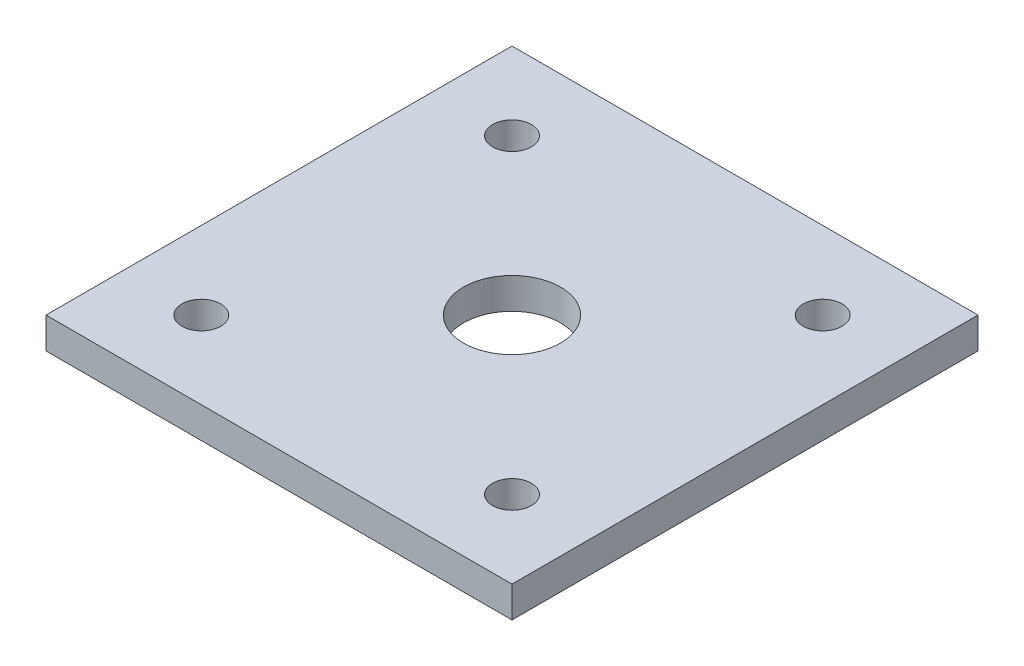
ISO-10303-21;
HEADER;
FILE_DESCRIPTION(('STEP AP214'),'2;1');
FILE_NAME('part.step','',(''),(''),'','','');
FILE_SCHEMA(('AUTOMOTIVE_DESIGN { 1 0 10303 214 1 1 1 1 }'));
ENDSEC;
DATA;
#1=APPLICATION_CONTEXT('core data for automotive mechanical design processes');
#2=APPLICATION_PROTOCOL_DEFINITION('international standard','automotive_design',2000,#1);
#3=PRODUCT_CONTEXT('',#1,'mechanical');
#4=PRODUCT('Part','Part','',(#3));
#5=PRODUCT_RELATED_PRODUCT_CATEGORY('part','',(#4));
#6=PRODUCT_DEFINITION_FORMATION('','',#4);
#7=PRODUCT_DEFINITION_CONTEXT('part definition',#1,'design');
#8=PRODUCT_DEFINITION('design','',#6,#7);
#9=PRODUCT_DEFINITION_SHAPE('','',#8);
#10=(LENGTH_UNIT() NAMED_UNIT(*) SI_UNIT(.MILLI.,.METRE.));
#11=(NAMED_UNIT(*) PLANE_ANGLE_UNIT() SI_UNIT($,.RADIAN.));
#12=(NAMED_UNIT(*) SI_UNIT($,.STERADIAN.) SOLID_ANGLE_UNIT());
#13=UNCERTAINTY_MEASURE_WITH_UNIT(LENGTH_MEASURE(1.E-05),#10,'distance_accuracy_value','');
#14=(GEOMETRIC_REPRESENTATION_CONTEXT(3) GLOBAL_UNCERTAINTY_ASSIGNED_CONTEXT((#13)) GLOBAL_UNIT_ASSIGNED_CONTEXT((#10,
#11,#12)) REPRESENTATION_CONTEXT('',''));
#15=CARTESIAN_POINT('',(0.,0.,0.));
#16=DIRECTION('',(0.,0.,1.));
#17=DIRECTION('',(1.,0.,0.));
#18=AXIS2_PLACEMENT_3D('',#15,#16,#17);
#19=CARTESIAN_POINT('',(-60.,8.,60.));
#20=DIRECTION('',(1.,0.,0.));
#21=DIRECTION('',(0.,0.,-1.));
#22=AXIS2_PLACEMENT_3D('',#19,#20,#21);
#23=PLANE('',#22);
#24=DIRECTION('',(0.,0.,1.));
#25=VECTOR('',#24,1.);
#26=CARTESIAN_POINT('',(-60.,0.,60.));
#27=LINE('',#26,#25);
#28=CARTESIAN_POINT('',(-60.,0.,-60.));
#29=VERTEX_POINT('',#28);
#30=CARTESIAN_POINT('',(-60.,0.,60.));
#31=VERTEX_POINT('',#30);
#32=EDGE_CURVE('E107',#29,#31,#27,.T.);
#33=ORIENTED_EDGE('',*,*,#32,.T.);
#34=DIRECTION('',(0.,-1.,0.));
#35=VECTOR('',#34,1.);
#36=CARTESIAN_POINT('',(-60.,8.,60.));
#37=LINE('',#36,#35);
#38=CARTESIAN_POINT('',(-60.,8.,60.));
#39=VERTEX_POINT('',#38);
#40=EDGE_CURVE('E11',#39,#31,#37,.T.);
#41=ORIENTED_EDGE('',*,*,#40,.F.);
#42=DIRECTION('',(0.,0.,1.));
#43=VECTOR('',#42,1.);
#44=CARTESIAN_POINT('',(-60.,8.,60.));
#45=LINE('',#44,#43);
#46=CARTESIAN_POINT('',(-60.,8.,-60.));
#47=VERTEX_POINT('',#46);
#48=EDGE_CURVE('E91',#47,#39,#45,.T.);
#49=ORIENTED_EDGE('',*,*,#48,.F.);
#50=DIRECTION('',(0.,-1.,0.));
#51=VECTOR('',#50,1.);
#52=CARTESIAN_POINT('',(-60.,8.,-60.));
#53=LINE('',#52,#51);
#54=EDGE_CURVE('E103',#47,#29,#53,.T.);
#55=ORIENTED_EDGE('',*,*,#54,.T.);
#56=EDGE_LOOP('',(#33,#41,#49,#55));
#57=FACE_BOUND('',#56,.T.);
#58=ADVANCED_FACE('F39',(#57),#23,.F.);
#59=CARTESIAN_POINT('',(60.,8.,60.));
#60=DIRECTION('',(0.,0.,-1.));
#61=DIRECTION('',(-1.,0.,0.));
#62=AXIS2_PLACEMENT_3D('',#59,#60,#61);
#63=PLANE('',#62);
#64=DIRECTION('',(1.,0.,0.));
#65=VECTOR('',#64,1.);
#66=CARTESIAN_POINT('',(60.,0.,60.));
#67=LINE('',#66,#65);
#68=CARTESIAN_POINT('',(60.,0.,60.));
#69=VERTEX_POINT('',#68);
#70=EDGE_CURVE('E96',#31,#69,#67,.T.);
#71=ORIENTED_EDGE('',*,*,#70,.T.);
#72=DIRECTION('',(0.,-1.,0.));
#73=VECTOR('',#72,1.);
#74=CARTESIAN_POINT('',(60.,8.,60.));
#75=LINE('',#74,#73);
#76=CARTESIAN_POINT('',(60.,8.,60.));
#77=VERTEX_POINT('',#76);
#78=EDGE_CURVE('E48',#77,#69,#75,.T.);
#79=ORIENTED_EDGE('',*,*,#78,.F.);
#80=DIRECTION('',(1.,0.,0.));
#81=VECTOR('',#80,1.);
#82=CARTESIAN_POINT('',(60.,8.,60.));
#83=LINE('',#82,#81);
#84=EDGE_CURVE('E86',#39,#77,#83,.T.);
#85=ORIENTED_EDGE('',*,*,#84,.F.);
#86=ORIENTED_EDGE('',*,*,#40,.T.);
#87=EDGE_LOOP('',(#71,#79,#85,#86));
#88=FACE_BOUND('',#87,.T.);
#89=ADVANCED_FACE('F95',(#88),#63,.F.);
#90=CARTESIAN_POINT('',(60.,8.,60.));
#91=DIRECTION('',(-1.,0.,0.));
#92=DIRECTION('',(0.,0.,1.));
#93=AXIS2_PLACEMENT_3D('',#90,#91,#92);
#94=PLANE('',#93);
#95=DIRECTION('',(0.,0.,-1.));
#96=VECTOR('',#95,1.);
#97=CARTESIAN_POINT('',(60.,0.,60.));
#98=LINE('',#97,#96);
#99=CARTESIAN_POINT('',(60.,0.,-60.));
#100=VERTEX_POINT('',#99);
#101=EDGE_CURVE('E73',#69,#100,#98,.T.);
#102=ORIENTED_EDGE('',*,*,#101,.T.);
#103=DIRECTION('',(0.,-1.,0.));
#104=VECTOR('',#103,1.);
#105=CARTESIAN_POINT('',(60.,8.,-60.));
#106=LINE('',#105,#104);
#107=CARTESIAN_POINT('',(60.,8.,-60.));
#108=VERTEX_POINT('',#107);
#109=EDGE_CURVE('E98',#108,#100,#106,.T.);
#110=ORIENTED_EDGE('',*,*,#109,.F.);
#111=DIRECTION('',(0.,0.,-1.));
#112=VECTOR('',#111,1.);
#113=CARTESIAN_POINT('',(60.,8.,60.));
#114=LINE('',#113,#112);
#115=EDGE_CURVE('E89',#77,#108,#114,.T.);
#116=ORIENTED_EDGE('',*,*,#115,.F.);
#117=ORIENTED_EDGE('',*,*,#78,.T.);
#118=EDGE_LOOP('',(#102,#110,#116,#117));
#119=FACE_BOUND('',#118,.T.);
#120=ADVANCED_FACE('F99',(#119),#94,.F.);
#121=CARTESIAN_POINT('',(60.,8.,-60.));
#122=DIRECTION('',(0.,0.,1.));
#123=DIRECTION('',(1.,0.,0.));
#124=AXIS2_PLACEMENT_3D('',#121,#122,#123);
#125=PLANE('',#124);
#126=DIRECTION('',(-1.,0.,0.));
#127=VECTOR('',#126,1.);
#128=CARTESIAN_POINT('',(60.,0.,-60.));
#129=LINE('',#128,#127);
#130=EDGE_CURVE('E79',#100,#29,#129,.T.);
#131=ORIENTED_EDGE('',*,*,#130,.T.);
#132=ORIENTED_EDGE('',*,*,#54,.F.);
#133=DIRECTION('',(-1.,0.,0.));
#134=VECTOR('',#133,1.);
#135=CARTESIAN_POINT('',(60.,8.,-60.));
#136=LINE('',#135,#134);
#137=EDGE_CURVE('E56',#108,#47,#136,.T.);
#138=ORIENTED_EDGE('',*,*,#137,.F.);
#139=ORIENTED_EDGE('',*,*,#109,.T.);
#140=EDGE_LOOP('',(#131,#132,#138,#139));
#141=FACE_BOUND('',#140,.T.);
#142=ADVANCED_FACE('F121',(#141),#125,.F.);
#143=CARTESIAN_POINT('',(0.,8.,0.));
#144=DIRECTION('',(0.,1.,0.));
#145=DIRECTION('',(0.,0.,1.));
#146=AXIS2_PLACEMENT_3D('',#143,#144,#145);
#147=PLANE('',#146);
#148=CARTESIAN_POINT('',(-39.9999999999999,8.,40.0000000000001));
#149=DIRECTION('',(0.,1.,0.));
#150=DIRECTION('',(1.,0.,0.));
#151=AXIS2_PLACEMENT_3D('',#148,#149,#150);
#152=CIRCLE('',#151,5.00000000000001);
#153=CARTESIAN_POINT('',(-34.9999999999999,8.,40.0000000000001));
#154=VERTEX_POINT('',#153);
#155=EDGE_CURVE('E160',#154,#154,#152,.T.);
#156=ORIENTED_EDGE('',*,*,#155,.F.);
#157=EDGE_LOOP('',(#156));
#158=FACE_BOUND('',#157,.T.);
#159=CARTESIAN_POINT('',(40.,8.,40.));
#160=DIRECTION('',(0.,1.,0.));
#161=DIRECTION('',(0.,0.,-1.));
#162=AXIS2_PLACEMENT_3D('',#159,#160,#161);
#163=CIRCLE('',#162,5.00000000000001);
#164=CARTESIAN_POINT('',(40.,8.,35.));
#165=VERTEX_POINT('',#164);
#166=EDGE_CURVE('E152',#165,#165,#163,.T.);
#167=ORIENTED_EDGE('',*,*,#166,.F.);
#168=EDGE_LOOP('',(#167));
#169=FACE_BOUND('',#168,.T.);
#170=CARTESIAN_POINT('',(39.9999999999996,8.,-40.0000000000004));
#171=DIRECTION('',(0.,1.,0.));
#172=DIRECTION('',(-1.,0.,0.));
#173=AXIS2_PLACEMENT_3D('',#170,#171,#172);
#174=CIRCLE('',#173,5.00000000000001);
#175=CARTESIAN_POINT('',(34.9999999999996,8.,-40.0000000000004));
#176=VERTEX_POINT('',#175);
#177=EDGE_CURVE('E144',#176,#176,#174,.T.);
#178=ORIENTED_EDGE('',*,*,#177,.F.);
#179=EDGE_LOOP('',(#178));
#180=FACE_BOUND('',#179,.T.);
#181=CARTESIAN_POINT('',(-40.,8.,-40.));
#182=DIRECTION('',(0.,1.,0.));
#183=DIRECTION('',(0.,0.,1.));
#184=AXIS2_PLACEMENT_3D('',#181,#182,#183);
#185=CIRCLE('',#184,5.00000000000001);
#186=CARTESIAN_POINT('',(-40.,8.,-35.));
#187=VERTEX_POINT('',#186);
#188=EDGE_CURVE('E136',#187,#187,#185,.T.);
#189=ORIENTED_EDGE('',*,*,#188,.F.);
#190=EDGE_LOOP('',(#189));
#191=FACE_BOUND('',#190,.T.);
#192=CARTESIAN_POINT('',(0.,8.,0.));
#193=DIRECTION('',(0.,1.,0.));
#194=DIRECTION('',(0.,0.,1.));
#195=AXIS2_PLACEMENT_3D('',#192,#193,#194);
#196=CIRCLE('',#195,12.5);
#197=CARTESIAN_POINT('',(0.,8.,12.5));
#198=VERTEX_POINT('',#197);
#199=EDGE_CURVE('E128',#198,#198,#196,.T.);
#200=ORIENTED_EDGE('',*,*,#199,.F.);
#201=EDGE_LOOP('',(#200));
#202=FACE_BOUND('',#201,.T.);
#203=ORIENTED_EDGE('',*,*,#48,.T.);
#204=ORIENTED_EDGE('',*,*,#84,.T.);
#205=ORIENTED_EDGE('',*,*,#115,.T.);
#206=ORIENTED_EDGE('',*,*,#137,.T.);
#207=EDGE_LOOP('',(#203,#204,#205,#206));
#208=FACE_BOUND('',#207,.T.);
#209=ADVANCED_FACE('F87',(#158,#169,#180,#191,#202,#208),#147,.T.);
#210=CARTESIAN_POINT('',(0.,0.,0.));
#211=DIRECTION('',(0.,1.,0.));
#212=DIRECTION('',(0.,0.,1.));
#213=AXIS2_PLACEMENT_3D('',#210,#211,#212);
#214=PLANE('',#213);
#215=CARTESIAN_POINT('',(-39.9999999999999,0.,40.0000000000001));
#216=DIRECTION('',(0.,1.,0.));
#217=DIRECTION('',(1.,0.,0.));
#218=AXIS2_PLACEMENT_3D('',#215,#216,#217);
#219=CIRCLE('',#218,5.00000000000001);
#220=CARTESIAN_POINT('',(-34.9999999999999,0.,40.0000000000001));
#221=VERTEX_POINT('',#220);
#222=EDGE_CURVE('E140',#221,#221,#219,.T.);
#223=ORIENTED_EDGE('',*,*,#222,.T.);
#224=EDGE_LOOP('',(#223));
#225=FACE_BOUND('',#224,.T.);
#226=CARTESIAN_POINT('',(40.,0.,40.));
#227=DIRECTION('',(0.,1.,0.));
#228=DIRECTION('',(0.,0.,-1.));
#229=AXIS2_PLACEMENT_3D('',#226,#227,#228);
#230=CIRCLE('',#229,5.00000000000001);
#231=CARTESIAN_POINT('',(40.,0.,35.));
#232=VERTEX_POINT('',#231);
#233=EDGE_CURVE('E156',#232,#232,#230,.T.);
#234=ORIENTED_EDGE('',*,*,#233,.T.);
#235=EDGE_LOOP('',(#234));
#236=FACE_BOUND('',#235,.T.);
#237=CARTESIAN_POINT('',(39.9999999999996,0.,-40.0000000000004));
#238=DIRECTION('',(0.,1.,0.));
#239=DIRECTION('',(-1.,0.,0.));
#240=AXIS2_PLACEMENT_3D('',#237,#238,#239);
#241=CIRCLE('',#240,5.00000000000001);
#242=CARTESIAN_POINT('',(34.9999999999996,0.,-40.0000000000004));
#243=VERTEX_POINT('',#242);
#244=EDGE_CURVE('E148',#243,#243,#241,.T.);
#245=ORIENTED_EDGE('',*,*,#244,.T.);
#246=EDGE_LOOP('',(#245));
#247=FACE_BOUND('',#246,.T.);
#248=CARTESIAN_POINT('',(-40.,0.,-40.));
#249=DIRECTION('',(0.,1.,0.));
#250=DIRECTION('',(0.,0.,1.));
#251=AXIS2_PLACEMENT_3D('',#248,#249,#250);
#252=CIRCLE('',#251,5.00000000000001);
#253=CARTESIAN_POINT('',(-40.,0.,-35.));
#254=VERTEX_POINT('',#253);
#255=EDGE_CURVE('E132',#254,#254,#252,.T.);
#256=ORIENTED_EDGE('',*,*,#255,.T.);
#257=EDGE_LOOP('',(#256));
#258=FACE_BOUND('',#257,.T.);
#259=CARTESIAN_POINT('',(0.,0.,0.));
#260=DIRECTION('',(0.,1.,0.));
#261=DIRECTION('',(0.,0.,1.));
#262=AXIS2_PLACEMENT_3D('',#259,#260,#261);
#263=CIRCLE('',#262,12.5);
#264=CARTESIAN_POINT('',(0.,0.,12.5));
#265=VERTEX_POINT('',#264);
#266=EDGE_CURVE('E111',#265,#265,#263,.T.);
#267=ORIENTED_EDGE('',*,*,#266,.T.);
#268=EDGE_LOOP('',(#267));
#269=FACE_BOUND('',#268,.T.);
#270=ORIENTED_EDGE('',*,*,#32,.F.);
#271=ORIENTED_EDGE('',*,*,#130,.F.);
#272=ORIENTED_EDGE('',*,*,#101,.F.);
#273=ORIENTED_EDGE('',*,*,#70,.F.);
#274=EDGE_LOOP('',(#270,#271,#272,#273));
#275=FACE_BOUND('',#274,.T.);
#276=ADVANCED_FACE('F124',(#225,#236,#247,#258,#269,#275),#214,.F.);
#277=CARTESIAN_POINT('',(0.,0.,0.));
#278=DIRECTION('',(0.,1.,0.));
#279=DIRECTION('',(0.,0.,1.));
#280=AXIS2_PLACEMENT_3D('',#277,#278,#279);
#281=CYLINDRICAL_SURFACE('',#280,12.5);
#282=ORIENTED_EDGE('',*,*,#266,.F.);
#283=EDGE_LOOP('',(#282));
#284=FACE_BOUND('',#283,.T.);
#285=ORIENTED_EDGE('',*,*,#199,.T.);
#286=EDGE_LOOP('',(#285));
#287=FACE_BOUND('',#286,.T.);
#288=ADVANCED_FACE('F188',(#284,#287),#281,.F.);
#289=CARTESIAN_POINT('',(-40.,0.,-40.));
#290=DIRECTION('',(0.,1.,0.));
#291=DIRECTION('',(0.,0.,1.));
#292=AXIS2_PLACEMENT_3D('',#289,#290,#291);
#293=CYLINDRICAL_SURFACE('',#292,5.00000000000001);
#294=ORIENTED_EDGE('',*,*,#255,.F.);
#295=EDGE_LOOP('',(#294));
#296=FACE_BOUND('',#295,.T.);
#297=ORIENTED_EDGE('',*,*,#188,.T.);
#298=EDGE_LOOP('',(#297));
#299=FACE_BOUND('',#298,.T.);
#300=ADVANCED_FACE('F190',(#296,#299),#293,.F.);
#301=CARTESIAN_POINT('',(39.9999999999996,0.,-40.0000000000004));
#302=DIRECTION('',(0.,1.,0.));
#303=DIRECTION('',(0.,0.,1.));
#304=AXIS2_PLACEMENT_3D('',#301,#302,#303);
#305=CYLINDRICAL_SURFACE('',#304,5.00000000000001);
#306=ORIENTED_EDGE('',*,*,#244,.F.);
#307=EDGE_LOOP('',(#306));
#308=FACE_BOUND('',#307,.T.);
#309=ORIENTED_EDGE('',*,*,#177,.T.);
#310=EDGE_LOOP('',(#309));
#311=FACE_BOUND('',#310,.T.);
#312=ADVANCED_FACE('F197',(#308,#311),#305,.F.);
#313=CARTESIAN_POINT('',(40.,0.,40.));
#314=DIRECTION('',(0.,1.,0.));
#315=DIRECTION('',(0.,0.,1.));
#316=AXIS2_PLACEMENT_3D('',#313,#314,#315);
#317=CYLINDRICAL_SURFACE('',#316,5.00000000000001);
#318=ORIENTED_EDGE('',*,*,#233,.F.);
#319=EDGE_LOOP('',(#318));
#320=FACE_BOUND('',#319,.T.);
#321=ORIENTED_EDGE('',*,*,#166,.T.);
#322=EDGE_LOOP('',(#321));
#323=FACE_BOUND('',#322,.T.);
#324=ADVANCED_FACE('F173',(#320,#323),#317,.F.);
#325=CARTESIAN_POINT('',(-39.9999999999999,0.,40.0000000000001));
#326=DIRECTION('',(0.,1.,0.));
#327=DIRECTION('',(0.,0.,1.));
#328=AXIS2_PLACEMENT_3D('',#325,#326,#327);
#329=CYLINDRICAL_SURFACE('',#328,5.00000000000001);
#330=ORIENTED_EDGE('',*,*,#222,.F.);
#331=EDGE_LOOP('',(#330));
#332=FACE_BOUND('',#331,.T.);
#333=ORIENTED_EDGE('',*,*,#155,.T.);
#334=EDGE_LOOP('',(#333));
#335=FACE_BOUND('',#334,.T.);
#336=ADVANCED_FACE('F170',(#332,#335),#329,.F.);
#337=CLOSED_SHELL('',(#58,#89,#120,#142,#209,#276,#288,#300,#312,#324,#336));
#338=MANIFOLD_SOLID_BREP('B2',#337);
#339=ADVANCED_BREP_SHAPE_REPRESENTATION('',(#18,#338),#14);
#340=SHAPE_DEFINITION_REPRESENTATION(#9,#339);
ENDSEC;
END-ISO-10303-21;
